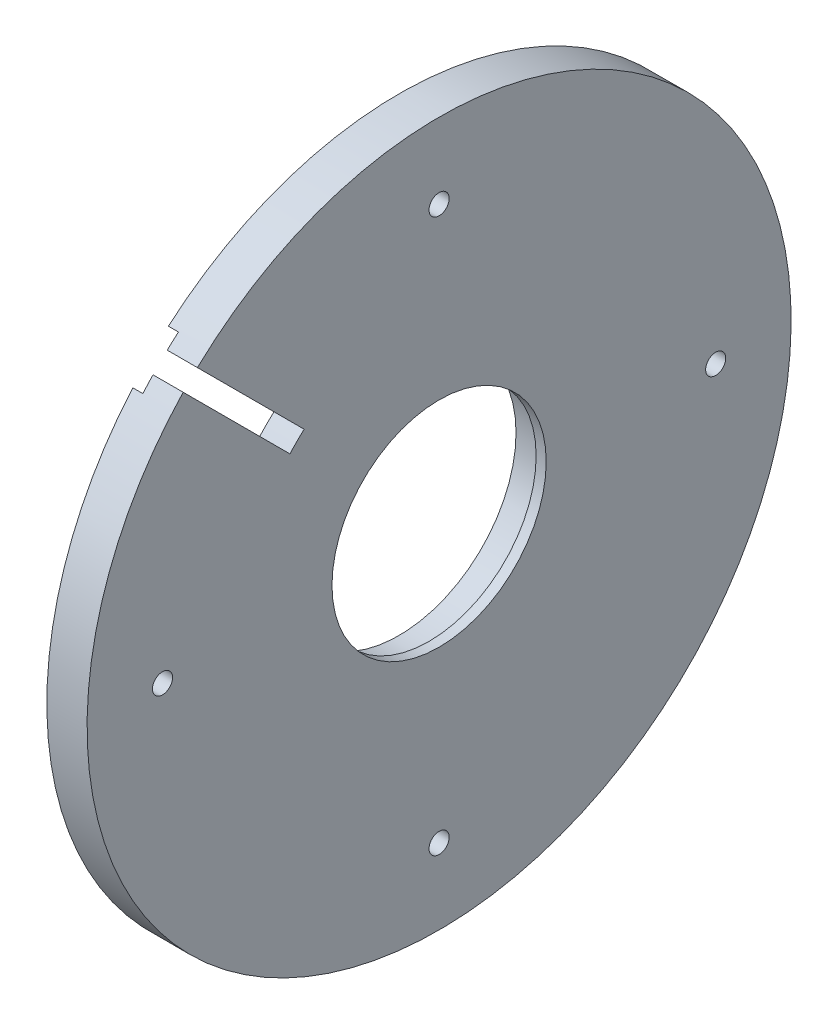
ISO-10303-21;
HEADER;
FILE_DESCRIPTION(('STEP AP214'),'2;1');
FILE_NAME('part.step','',(''),(''),'','','');
FILE_SCHEMA(('AUTOMOTIVE_DESIGN { 1 0 10303 214 1 1 1 1 }'));
ENDSEC;
DATA;
#1=APPLICATION_CONTEXT('core data for automotive mechanical design processes');
#2=APPLICATION_PROTOCOL_DEFINITION('international standard','automotive_design',2000,#1);
#3=PRODUCT_CONTEXT('',#1,'mechanical');
#4=PRODUCT('Part','Part','',(#3));
#5=PRODUCT_RELATED_PRODUCT_CATEGORY('part','',(#4));
#6=PRODUCT_DEFINITION_FORMATION('','',#4);
#7=PRODUCT_DEFINITION_CONTEXT('part definition',#1,'design');
#8=PRODUCT_DEFINITION('design','',#6,#7);
#9=PRODUCT_DEFINITION_SHAPE('','',#8);
#10=(LENGTH_UNIT() NAMED_UNIT(*) SI_UNIT(.MILLI.,.METRE.));
#11=(NAMED_UNIT(*) PLANE_ANGLE_UNIT() SI_UNIT($,.RADIAN.));
#12=(NAMED_UNIT(*) SI_UNIT($,.STERADIAN.) SOLID_ANGLE_UNIT());
#13=UNCERTAINTY_MEASURE_WITH_UNIT(LENGTH_MEASURE(1.E-05),#10,'distance_accuracy_value','');
#14=(GEOMETRIC_REPRESENTATION_CONTEXT(3) GLOBAL_UNCERTAINTY_ASSIGNED_CONTEXT((#13)) GLOBAL_UNIT_ASSIGNED_CONTEXT((#10,
#11,#12)) REPRESENTATION_CONTEXT('',''));
#15=CARTESIAN_POINT('',(0.,0.,0.));
#16=DIRECTION('',(0.,0.,1.));
#17=DIRECTION('',(1.,0.,0.));
#18=AXIS2_PLACEMENT_3D('',#15,#16,#17);
#19=CARTESIAN_POINT('',(10.,23.4767178356885,24.9582128406425));
#20=DIRECTION('',(-1.,0.,0.));
#21=DIRECTION('',(0.,0.,1.));
#22=AXIS2_PLACEMENT_3D('',#19,#20,#21);
#23=CYLINDRICAL_SURFACE('',#22,20.);
#24=CARTESIAN_POINT('',(0.999999999999999,23.4767178356885,24.9582128406425));
#25=DIRECTION('',(-1.,0.,0.));
#26=DIRECTION('',(0.,0.,1.));
#27=AXIS2_PLACEMENT_3D('',#24,#25,#26);
#28=CIRCLE('',#27,20.);
#29=CARTESIAN_POINT('',(0.999999999999999,36.8940579463275,39.7897665136553));
#30=VERTEX_POINT('',#29);
#31=CARTESIAN_POINT('',(0.999999999999999,38.3082715087006,38.3755529512816));
#32=VERTEX_POINT('',#31);
#33=EDGE_CURVE('E179',#30,#32,#28,.T.);
#34=ORIENTED_EDGE('',*,*,#33,.F.);
#35=DIRECTION('',(-1.,0.,0.));
#36=VECTOR('',#35,1.);
#37=CARTESIAN_POINT('',(10.,36.8940579463275,39.7897665136546));
#38=LINE('',#37,#36);
#39=CARTESIAN_POINT('',(4.,36.8940579463275,39.7897665136546));
#40=VERTEX_POINT('',#39);
#41=EDGE_CURVE('E106',#40,#30,#38,.T.);
#42=ORIENTED_EDGE('',*,*,#41,.F.);
#43=CARTESIAN_POINT('',(4.,23.4767178356885,24.9582128406425));
#44=DIRECTION('',(1.,0.,0.));
#45=DIRECTION('',(0.,0.,-1.));
#46=AXIS2_PLACEMENT_3D('',#43,#44,#45);
#47=CIRCLE('',#46,20.);
#48=CARTESIAN_POINT('',(4.,38.3082715087006,38.3755529512816));
#49=VERTEX_POINT('',#48);
#50=EDGE_CURVE('E55',#40,#49,#47,.F.);
#51=ORIENTED_EDGE('',*,*,#50,.T.);
#52=DIRECTION('',(-1.,0.,0.));
#53=VECTOR('',#52,1.);
#54=CARTESIAN_POINT('',(10.,38.3082715087006,38.3755529512816));
#55=LINE('',#54,#53);
#56=EDGE_CURVE('E135',#49,#32,#55,.T.);
#57=ORIENTED_EDGE('',*,*,#56,.T.);
#58=EDGE_LOOP('',(#34,#42,#51,#57));
#59=FACE_BOUND('',#58,.T.);
#60=ADVANCED_FACE('F32',(#59),#23,.T.);
#61=CARTESIAN_POINT('',(10.,38.3082715087006,38.3755529512816));
#62=DIRECTION('',(0.,0.707106781186552,-0.707106781186543));
#63=DIRECTION('',(0.,0.707106781186543,0.707106781186552));
#64=AXIS2_PLACEMENT_3D('',#61,#62,#63);
#65=PLANE('',#64);
#66=DIRECTION('',(0.,-0.707106781186543,-0.707106781186552));
#67=VECTOR('',#66,1.);
#68=CARTESIAN_POINT('',(1.,38.9214510333326,38.9887324759136));
#69=LINE('',#68,#67);
#70=CARTESIAN_POINT('',(1.,48.9224583705808,48.9897398131619));
#71=VERTEX_POINT('',#70);
#72=EDGE_CURVE('E413',#71,#32,#69,.T.);
#73=ORIENTED_EDGE('',*,*,#72,.T.);
#74=ORIENTED_EDGE('',*,*,#56,.F.);
#75=DIRECTION('',(0.,0.707106781186543,0.707106781186552));
#76=VECTOR('',#75,1.);
#77=CARTESIAN_POINT('',(4.,24.183824616875,24.2511060594558));
#78=LINE('',#77,#76);
#79=CARTESIAN_POINT('',(4.,48.9224583705808,48.9897398131619));
#80=VERTEX_POINT('',#79);
#81=EDGE_CURVE('E206',#49,#80,#78,.T.);
#82=ORIENTED_EDGE('',*,*,#81,.T.);
#83=DIRECTION('',(-1.,0.,0.));
#84=VECTOR('',#83,1.);
#85=CARTESIAN_POINT('',(4.,48.9224583705808,48.9897398131619));
#86=LINE('',#85,#84);
#87=EDGE_CURVE('E47',#71,#80,#86,.F.);
#88=ORIENTED_EDGE('',*,*,#87,.F.);
#89=EDGE_LOOP('',(#73,#74,#82,#88));
#90=FACE_BOUND('',#89,.T.);
#91=ADVANCED_FACE('F236',(#90),#65,.F.);
#92=CARTESIAN_POINT('',(10.,47.5183483960309,50.4140569633582));
#93=DIRECTION('',(0.,-0.707106781186528,0.707106781186567));
#94=DIRECTION('',(0.,-0.707106781186567,-0.707106781186528));
#95=AXIS2_PLACEMENT_3D('',#92,#93,#94);
#96=PLANE('',#95);
#97=DIRECTION('',(0.,-0.707106781186567,-0.707106781186528));
#98=VECTOR('',#97,1.);
#99=CARTESIAN_POINT('',(0.999999999999999,47.5183483960309,50.4140569633582));
#100=LINE('',#99,#98);
#101=CARTESIAN_POINT('',(1.,47.5082448082077,50.403953375535));
#102=VERTEX_POINT('',#101);
#103=EDGE_CURVE('E100',#102,#30,#100,.T.);
#104=ORIENTED_EDGE('',*,*,#103,.F.);
#105=DIRECTION('',(-1.,0.,0.));
#106=VECTOR('',#105,1.);
#107=CARTESIAN_POINT('',(4.,47.5082448082077,50.403953375535));
#108=LINE('',#107,#106);
#109=CARTESIAN_POINT('',(4.,47.5082448082077,50.403953375535));
#110=VERTEX_POINT('',#109);
#111=EDGE_CURVE('E104',#110,#102,#108,.T.);
#112=ORIENTED_EDGE('',*,*,#111,.F.);
#113=DIRECTION('',(0.,-0.707106781186567,-0.707106781186528));
#114=VECTOR('',#113,1.);
#115=CARTESIAN_POINT('',(4.,22.7696110545011,25.6653196218298));
#116=LINE('',#115,#114);
#117=EDGE_CURVE('E203',#110,#40,#116,.T.);
#118=ORIENTED_EDGE('',*,*,#117,.T.);
#119=ORIENTED_EDGE('',*,*,#41,.T.);
#120=EDGE_LOOP('',(#104,#112,#118,#119));
#121=FACE_BOUND('',#120,.T.);
#122=ADVANCED_FACE('F102',(#121),#96,.F.);
#123=CARTESIAN_POINT('',(3.,23.4767178356883,24.9582128406425));
#124=DIRECTION('',(-1.,0.,0.));
#125=DIRECTION('',(0.,0.,1.));
#126=AXIS2_PLACEMENT_3D('',#123,#124,#125);
#127=PLANE('',#126);
#128=CARTESIAN_POINT('',(3.,23.4767178356883,24.9582128406425));
#129=DIRECTION('',(-1.,0.,0.));
#130=DIRECTION('',(0.,0.,1.));
#131=AXIS2_PLACEMENT_3D('',#128,#129,#130);
#132=CIRCLE('',#131,10.6500000000003);
#133=CARTESIAN_POINT('',(3.,23.4767178356883,35.6082128406428));
#134=VERTEX_POINT('',#133);
#135=EDGE_CURVE('E189',#134,#134,#132,.T.);
#136=ORIENTED_EDGE('',*,*,#135,.F.);
#137=EDGE_LOOP('',(#136));
#138=FACE_BOUND('',#137,.T.);
#139=CARTESIAN_POINT('',(3.,23.4767178356883,24.9582128406425));
#140=DIRECTION('',(-1.,0.,0.));
#141=DIRECTION('',(0.,0.,1.));
#142=AXIS2_PLACEMENT_3D('',#139,#140,#141);
#143=CIRCLE('',#142,11.1500000000002);
#144=CARTESIAN_POINT('',(3.,23.4767178356883,36.1082128406427));
#145=VERTEX_POINT('',#144);
#146=EDGE_CURVE('E119',#145,#145,#143,.T.);
#147=ORIENTED_EDGE('',*,*,#146,.T.);
#148=EDGE_LOOP('',(#147));
#149=FACE_BOUND('',#148,.T.);
#150=ADVANCED_FACE('F247',(#138,#149),#127,.T.);
#151=CARTESIAN_POINT('',(4.,23.4767178356883,24.9582128406425));
#152=DIRECTION('',(1.,0.,0.));
#153=DIRECTION('',(0.,0.,-1.));
#154=AXIS2_PLACEMENT_3D('',#151,#152,#153);
#155=PLANE('',#154);
#156=CARTESIAN_POINT('',(4.,50.9767178356883,24.9582128406422));
#157=DIRECTION('',(1.,0.,0.));
#158=DIRECTION('',(0.,0.,-1.));
#159=AXIS2_PLACEMENT_3D('',#156,#157,#158);
#160=CIRCLE('',#159,1.);
#161=CARTESIAN_POINT('',(4.,50.9767178356883,23.9582128406422));
#162=VERTEX_POINT('',#161);
#163=EDGE_CURVE('E148',#162,#162,#160,.T.);
#164=ORIENTED_EDGE('',*,*,#163,.F.);
#165=EDGE_LOOP('',(#164));
#166=FACE_BOUND('',#165,.T.);
#167=CARTESIAN_POINT('',(4.,23.4767178356885,52.4582128406425));
#168=DIRECTION('',(1.,0.,0.));
#169=DIRECTION('',(0.,0.,-1.));
#170=AXIS2_PLACEMENT_3D('',#167,#168,#169);
#171=CIRCLE('',#170,0.999999999999996);
#172=CARTESIAN_POINT('',(4.,23.4767178356885,51.4582128406425));
#173=VERTEX_POINT('',#172);
#174=EDGE_CURVE('E144',#173,#173,#171,.T.);
#175=ORIENTED_EDGE('',*,*,#174,.F.);
#176=EDGE_LOOP('',(#175));
#177=FACE_BOUND('',#176,.T.);
#178=CARTESIAN_POINT('',(4.,-4.02328216431167,24.9582128406426));
#179=DIRECTION('',(1.,0.,0.));
#180=DIRECTION('',(0.,0.,-1.));
#181=AXIS2_PLACEMENT_3D('',#178,#179,#180);
#182=CIRCLE('',#181,1.);
#183=CARTESIAN_POINT('',(4.,-4.02328216431167,23.9582128406426));
#184=VERTEX_POINT('',#183);
#185=EDGE_CURVE('E140',#184,#184,#182,.T.);
#186=ORIENTED_EDGE('',*,*,#185,.F.);
#187=EDGE_LOOP('',(#186));
#188=FACE_BOUND('',#187,.T.);
#189=CARTESIAN_POINT('',(4.,23.4767178356883,-2.54178715935752));
#190=DIRECTION('',(1.,0.,0.));
#191=DIRECTION('',(0.,0.,-1.));
#192=AXIS2_PLACEMENT_3D('',#189,#190,#191);
#193=CIRCLE('',#192,1.);
#194=CARTESIAN_POINT('',(4.,23.4767178356883,-3.54178715935752));
#195=VERTEX_POINT('',#194);
#196=EDGE_CURVE('E136',#195,#195,#193,.T.);
#197=ORIENTED_EDGE('',*,*,#196,.F.);
#198=EDGE_LOOP('',(#197));
#199=FACE_BOUND('',#198,.T.);
#200=ORIENTED_EDGE('',*,*,#81,.F.);
#201=ORIENTED_EDGE('',*,*,#50,.F.);
#202=ORIENTED_EDGE('',*,*,#117,.F.);
#203=CARTESIAN_POINT('',(4.,23.4767178356883,24.9582128406425));
#204=DIRECTION('',(1.,0.,0.));
#205=DIRECTION('',(0.,0.,-1.));
#206=AXIS2_PLACEMENT_3D('',#203,#204,#205);
#207=CIRCLE('',#206,35.);
#208=EDGE_CURVE('E124',#110,#80,#207,.T.);
#209=ORIENTED_EDGE('',*,*,#208,.T.);
#210=EDGE_LOOP('',(#200,#201,#202,#209));
#211=FACE_BOUND('',#210,.T.);
#212=CARTESIAN_POINT('',(4.,23.4767178356883,24.9582128406425));
#213=DIRECTION('',(-1.,0.,0.));
#214=DIRECTION('',(0.,0.,1.));
#215=AXIS2_PLACEMENT_3D('',#212,#213,#214);
#216=CIRCLE('',#215,10.6500000000003);
#217=CARTESIAN_POINT('',(4.,23.4767178356883,35.6082128406428));
#218=VERTEX_POINT('',#217);
#219=EDGE_CURVE('E188',#218,#218,#216,.T.);
#220=ORIENTED_EDGE('',*,*,#219,.T.);
#221=EDGE_LOOP('',(#220));
#222=FACE_BOUND('',#221,.T.);
#223=ADVANCED_FACE('F249',(#166,#177,#188,#199,#211,#222),#155,.T.);
#224=CARTESIAN_POINT('',(0.,23.4767178356883,24.9582128406425));
#225=DIRECTION('',(1.,0.,0.));
#226=DIRECTION('',(0.,0.,-1.));
#227=AXIS2_PLACEMENT_3D('',#224,#225,#226);
#228=PLANE('',#227);
#229=CARTESIAN_POINT('',(0.,50.9767178356883,24.9582128406422));
#230=DIRECTION('',(1.,0.,0.));
#231=DIRECTION('',(0.,0.,-1.));
#232=AXIS2_PLACEMENT_3D('',#229,#230,#231);
#233=CIRCLE('',#232,1.);
#234=CARTESIAN_POINT('',(0.,50.9767178356883,23.9582128406422));
#235=VERTEX_POINT('',#234);
#236=EDGE_CURVE('E145',#235,#235,#233,.T.);
#237=ORIENTED_EDGE('',*,*,#236,.T.);
#238=EDGE_LOOP('',(#237));
#239=FACE_BOUND('',#238,.T.);
#240=CARTESIAN_POINT('',(0.,23.4767178356885,52.4582128406425));
#241=DIRECTION('',(1.,0.,0.));
#242=DIRECTION('',(0.,0.,-1.));
#243=AXIS2_PLACEMENT_3D('',#240,#241,#242);
#244=CIRCLE('',#243,0.999999999999996);
#245=CARTESIAN_POINT('',(0.,23.4767178356885,51.4582128406425));
#246=VERTEX_POINT('',#245);
#247=EDGE_CURVE('E141',#246,#246,#244,.T.);
#248=ORIENTED_EDGE('',*,*,#247,.T.);
#249=EDGE_LOOP('',(#248));
#250=FACE_BOUND('',#249,.T.);
#251=CARTESIAN_POINT('',(0.,-4.02328216431167,24.9582128406426));
#252=DIRECTION('',(1.,0.,0.));
#253=DIRECTION('',(0.,0.,-1.));
#254=AXIS2_PLACEMENT_3D('',#251,#252,#253);
#255=CIRCLE('',#254,1.);
#256=CARTESIAN_POINT('',(0.,-4.02328216431167,23.9582128406426));
#257=VERTEX_POINT('',#256);
#258=EDGE_CURVE('E137',#257,#257,#255,.T.);
#259=ORIENTED_EDGE('',*,*,#258,.T.);
#260=EDGE_LOOP('',(#259));
#261=FACE_BOUND('',#260,.T.);
#262=CARTESIAN_POINT('',(0.,23.4767178356883,-2.54178715935752));
#263=DIRECTION('',(1.,0.,0.));
#264=DIRECTION('',(0.,0.,-1.));
#265=AXIS2_PLACEMENT_3D('',#262,#263,#264);
#266=CIRCLE('',#265,1.);
#267=CARTESIAN_POINT('',(0.,23.4767178356883,-3.54178715935752));
#268=VERTEX_POINT('',#267);
#269=EDGE_CURVE('E132',#268,#268,#266,.T.);
#270=ORIENTED_EDGE('',*,*,#269,.T.);
#271=EDGE_LOOP('',(#270));
#272=FACE_BOUND('',#271,.T.);
#273=DIRECTION('',(0.,-0.707106781186547,0.707106781186547));
#274=VECTOR('',#273,1.);
#275=CARTESIAN_POINT('',(0.,37.6011647275139,35.5471258265354));
#276=LINE('',#275,#274);
#277=CARTESIAN_POINT('',(0.,37.6011647275139,35.5471258265354));
#278=VERTEX_POINT('',#277);
#279=CARTESIAN_POINT('',(0.,34.0656308215811,39.0826597324682));
#280=VERTEX_POINT('',#279);
#281=EDGE_CURVE('E169',#278,#280,#276,.T.);
#282=ORIENTED_EDGE('',*,*,#281,.F.);
#283=DIRECTION('',(0.,-0.707106781186548,-0.707106781186548));
#284=VECTOR('',#283,1.);
#285=CARTESIAN_POINT('',(0.,38.3082715087005,36.254232607722));
#286=LINE('',#285,#284);
#287=CARTESIAN_POINT('',(0.,49.9300068613191,47.8759679603405));
#288=VERTEX_POINT('',#287);
#289=EDGE_CURVE('E160',#288,#278,#286,.T.);
#290=ORIENTED_EDGE('',*,*,#289,.F.);
#291=CARTESIAN_POINT('',(0.,23.4767178356883,24.9582128406425));
#292=DIRECTION('',(1.,0.,0.));
#293=DIRECTION('',(0.,0.,-1.));
#294=AXIS2_PLACEMENT_3D('',#291,#292,#293);
#295=CIRCLE('',#294,35.);
#296=CARTESIAN_POINT('',(0.,46.3944729553863,51.4115018662733));
#297=VERTEX_POINT('',#296);
#298=EDGE_CURVE('E128',#297,#288,#295,.T.);
#299=ORIENTED_EDGE('',*,*,#298,.F.);
#300=DIRECTION('',(0.,0.707106781186551,0.707106781186544));
#301=VECTOR('',#300,1.);
#302=CARTESIAN_POINT('',(0.,47.5082448082077,52.5252737190947));
#303=LINE('',#302,#301);
#304=EDGE_CURVE('E170',#280,#297,#303,.T.);
#305=ORIENTED_EDGE('',*,*,#304,.F.);
#306=EDGE_LOOP('',(#282,#290,#299,#305));
#307=FACE_BOUND('',#306,.T.);
#308=CARTESIAN_POINT('',(0.,23.4767178356883,24.9582128406425));
#309=DIRECTION('',(1.,0.,0.));
#310=DIRECTION('',(0.,0.,-1.));
#311=AXIS2_PLACEMENT_3D('',#308,#309,#310);
#312=CIRCLE('',#311,11.6500000000002);
#313=CARTESIAN_POINT('',(0.,23.4767178356883,13.3082128406423));
#314=VERTEX_POINT('',#313);
#315=EDGE_CURVE('E209',#314,#314,#312,.T.);
#316=ORIENTED_EDGE('',*,*,#315,.T.);
#317=EDGE_LOOP('',(#316));
#318=FACE_BOUND('',#317,.T.);
#319=ADVANCED_FACE('F165',(#239,#250,#261,#272,#307,#318),#228,.F.);
#320=CARTESIAN_POINT('',(4.,23.4767178356883,24.9582128406425));
#321=DIRECTION('',(-1.,0.,0.));
#322=DIRECTION('',(0.,0.,1.));
#323=AXIS2_PLACEMENT_3D('',#320,#321,#322);
#324=CYLINDRICAL_SURFACE('',#323,35.);
#325=CARTESIAN_POINT('',(1.,23.4767178356883,24.9582128406425));
#326=DIRECTION('',(-1.,0.,0.));
#327=DIRECTION('',(0.,0.,1.));
#328=AXIS2_PLACEMENT_3D('',#325,#326,#327);
#329=CIRCLE('',#328,35.);
#330=CARTESIAN_POINT('',(1.,46.3944729553862,51.4115018662733));
#331=VERTEX_POINT('',#330);
#332=EDGE_CURVE('E114',#331,#102,#329,.T.);
#333=ORIENTED_EDGE('',*,*,#332,.F.);
#334=DIRECTION('',(-1.,0.,0.));
#335=VECTOR('',#334,1.);
#336=CARTESIAN_POINT('',(4.,46.3944729553863,51.4115018662733));
#337=LINE('',#336,#335);
#338=EDGE_CURVE('E11',#331,#297,#337,.T.);
#339=ORIENTED_EDGE('',*,*,#338,.T.);
#340=ORIENTED_EDGE('',*,*,#298,.T.);
#341=DIRECTION('',(-1.,0.,0.));
#342=VECTOR('',#341,1.);
#343=CARTESIAN_POINT('',(4.,49.9300068613191,47.8759679603405));
#344=LINE('',#343,#342);
#345=CARTESIAN_POINT('',(1.,49.930006861319,47.8759679603405));
#346=VERTEX_POINT('',#345);
#347=EDGE_CURVE('E40',#288,#346,#344,.F.);
#348=ORIENTED_EDGE('',*,*,#347,.T.);
#349=EDGE_CURVE('E120',#71,#346,#329,.T.);
#350=ORIENTED_EDGE('',*,*,#349,.F.);
#351=ORIENTED_EDGE('',*,*,#87,.T.);
#352=ORIENTED_EDGE('',*,*,#208,.F.);
#353=ORIENTED_EDGE('',*,*,#111,.T.);
#354=EDGE_LOOP('',(#333,#339,#340,#348,#350,#351,#352,#353));
#355=FACE_BOUND('',#354,.T.);
#356=ADVANCED_FACE('F122',(#355),#324,.T.);
#357=CARTESIAN_POINT('',(4.,23.4767178356883,24.9582128406425));
#358=DIRECTION('',(-1.,0.,0.));
#359=DIRECTION('',(0.,0.,1.));
#360=AXIS2_PLACEMENT_3D('',#357,#358,#359);
#361=CYLINDRICAL_SURFACE('',#360,11.6500000000002);
#362=ORIENTED_EDGE('',*,*,#315,.F.);
#363=EDGE_LOOP('',(#362));
#364=FACE_BOUND('',#363,.T.);
#365=CARTESIAN_POINT('',(3.25,23.4767178356883,24.9582128406425));
#366=DIRECTION('',(-1.,0.,0.));
#367=DIRECTION('',(0.,0.,1.));
#368=AXIS2_PLACEMENT_3D('',#365,#366,#367);
#369=CIRCLE('',#368,11.6500000000002);
#370=CARTESIAN_POINT('',(3.25,23.4767178356883,36.6082128406427));
#371=VERTEX_POINT('',#370);
#372=EDGE_CURVE('E185',#371,#371,#369,.T.);
#373=ORIENTED_EDGE('',*,*,#372,.F.);
#374=EDGE_LOOP('',(#373));
#375=FACE_BOUND('',#374,.T.);
#376=ADVANCED_FACE('F213',(#364,#375),#361,.F.);
#377=CARTESIAN_POINT('',(-6.,23.4767178356883,-2.54178715935752));
#378=DIRECTION('',(1.,0.,0.));
#379=DIRECTION('',(0.,0.,-1.));
#380=AXIS2_PLACEMENT_3D('',#377,#378,#379);
#381=CYLINDRICAL_SURFACE('',#380,1.);
#382=ORIENTED_EDGE('',*,*,#196,.T.);
#383=EDGE_LOOP('',(#382));
#384=FACE_BOUND('',#383,.T.);
#385=ORIENTED_EDGE('',*,*,#269,.F.);
#386=EDGE_LOOP('',(#385));
#387=FACE_BOUND('',#386,.T.);
#388=ADVANCED_FACE('F216',(#384,#387),#381,.F.);
#389=CARTESIAN_POINT('',(-6.,-4.02328216431167,24.9582128406426));
#390=DIRECTION('',(1.,0.,0.));
#391=DIRECTION('',(0.,0.,-1.));
#392=AXIS2_PLACEMENT_3D('',#389,#390,#391);
#393=CYLINDRICAL_SURFACE('',#392,1.);
#394=ORIENTED_EDGE('',*,*,#185,.T.);
#395=EDGE_LOOP('',(#394));
#396=FACE_BOUND('',#395,.T.);
#397=ORIENTED_EDGE('',*,*,#258,.F.);
#398=EDGE_LOOP('',(#397));
#399=FACE_BOUND('',#398,.T.);
#400=ADVANCED_FACE('F272',(#396,#399),#393,.F.);
#401=CARTESIAN_POINT('',(-6.,23.4767178356885,52.4582128406425));
#402=DIRECTION('',(1.,0.,0.));
#403=DIRECTION('',(0.,0.,-1.));
#404=AXIS2_PLACEMENT_3D('',#401,#402,#403);
#405=CYLINDRICAL_SURFACE('',#404,0.999999999999996);
#406=ORIENTED_EDGE('',*,*,#174,.T.);
#407=EDGE_LOOP('',(#406));
#408=FACE_BOUND('',#407,.T.);
#409=ORIENTED_EDGE('',*,*,#247,.F.);
#410=EDGE_LOOP('',(#409));
#411=FACE_BOUND('',#410,.T.);
#412=ADVANCED_FACE('F279',(#408,#411),#405,.F.);
#413=CARTESIAN_POINT('',(-6.,50.9767178356883,24.9582128406422));
#414=DIRECTION('',(1.,0.,0.));
#415=DIRECTION('',(0.,0.,-1.));
#416=AXIS2_PLACEMENT_3D('',#413,#414,#415);
#417=CYLINDRICAL_SURFACE('',#416,1.);
#418=ORIENTED_EDGE('',*,*,#163,.T.);
#419=EDGE_LOOP('',(#418));
#420=FACE_BOUND('',#419,.T.);
#421=ORIENTED_EDGE('',*,*,#236,.F.);
#422=EDGE_LOOP('',(#421));
#423=FACE_BOUND('',#422,.T.);
#424=ADVANCED_FACE('F232',(#420,#423),#417,.F.);
#425=CARTESIAN_POINT('',(3.,23.4767178356883,24.9582128406425));
#426=DIRECTION('',(1.,0.,0.));
#427=DIRECTION('',(0.,0.,-1.));
#428=AXIS2_PLACEMENT_3D('',#425,#426,#427);
#429=CYLINDRICAL_SURFACE('',#428,10.6500000000003);
#430=ORIENTED_EDGE('',*,*,#135,.T.);
#431=EDGE_LOOP('',(#430));
#432=FACE_BOUND('',#431,.T.);
#433=ORIENTED_EDGE('',*,*,#219,.F.);
#434=EDGE_LOOP('',(#433));
#435=FACE_BOUND('',#434,.T.);
#436=ADVANCED_FACE('F223',(#432,#435),#429,.F.);
#437=CARTESIAN_POINT('',(3.25,23.4767178356883,24.9582128406425));
#438=DIRECTION('',(-1.,0.,0.));
#439=DIRECTION('',(0.,0.,1.));
#440=AXIS2_PLACEMENT_3D('',#437,#438,#439);
#441=PLANE('',#440);
#442=CARTESIAN_POINT('',(3.25,23.4767178356883,24.9582128406425));
#443=DIRECTION('',(-1.,0.,0.));
#444=DIRECTION('',(0.,0.,1.));
#445=AXIS2_PLACEMENT_3D('',#442,#443,#444);
#446=CIRCLE('',#445,11.2500000000002);
#447=CARTESIAN_POINT('',(3.25,23.4767178356883,36.2082128406427));
#448=VERTEX_POINT('',#447);
#449=EDGE_CURVE('E110',#448,#448,#446,.F.);
#450=ORIENTED_EDGE('',*,*,#449,.T.);
#451=EDGE_LOOP('',(#450));
#452=FACE_BOUND('',#451,.T.);
#453=ORIENTED_EDGE('',*,*,#372,.T.);
#454=EDGE_LOOP('',(#453));
#455=FACE_BOUND('',#454,.T.);
#456=ADVANCED_FACE('F220',(#452,#455),#441,.T.);
#457=CARTESIAN_POINT('',(3.25,23.4767178356883,24.9582128406425));
#458=DIRECTION('',(-1.,0.,0.));
#459=DIRECTION('',(0.,0.,1.));
#460=AXIS2_PLACEMENT_3D('',#457,#458,#459);
#461=CYLINDRICAL_SURFACE('',#460,11.1500000000002);
#462=CARTESIAN_POINT('',(3.15,23.4767178356883,24.9582128406425));
#463=DIRECTION('',(-1.,0.,0.));
#464=DIRECTION('',(0.,0.,1.));
#465=AXIS2_PLACEMENT_3D('',#462,#463,#464);
#466=CIRCLE('',#465,11.1500000000002);
#467=CARTESIAN_POINT('',(3.15,23.4767178356883,36.1082128406427));
#468=VERTEX_POINT('',#467);
#469=EDGE_CURVE('E126',#468,#468,#466,.T.);
#470=ORIENTED_EDGE('',*,*,#469,.T.);
#471=EDGE_LOOP('',(#470));
#472=FACE_BOUND('',#471,.T.);
#473=ORIENTED_EDGE('',*,*,#146,.F.);
#474=EDGE_LOOP('',(#473));
#475=FACE_BOUND('',#474,.T.);
#476=ADVANCED_FACE('F222',(#472,#475),#461,.T.);
#477=CARTESIAN_POINT('',(3.15,23.4767178356883,24.9582128406425));
#478=DIRECTION('',(-1.,0.,0.));
#479=DIRECTION('',(0.,0.,1.));
#480=AXIS2_PLACEMENT_3D('',#477,#478,#479);
#481=TOROIDAL_SURFACE('',#480,11.2500000000002,0.1);
#482=ORIENTED_EDGE('',*,*,#449,.F.);
#483=EDGE_LOOP('',(#482));
#484=FACE_BOUND('',#483,.T.);
#485=ORIENTED_EDGE('',*,*,#469,.F.);
#486=EDGE_LOOP('',(#485));
#487=FACE_BOUND('',#486,.T.);
#488=ADVANCED_FACE('F34',(#484,#487),#481,.F.);
#489=CARTESIAN_POINT('',(1.,38.3082715087005,36.254232607722));
#490=DIRECTION('',(0.,0.707106781186548,-0.707106781186548));
#491=DIRECTION('',(0.,0.707106781186548,0.707106781186548));
#492=AXIS2_PLACEMENT_3D('',#489,#490,#491);
#493=PLANE('',#492);
#494=ORIENTED_EDGE('',*,*,#289,.T.);
#495=DIRECTION('',(-1.,0.,0.));
#496=VECTOR('',#495,1.);
#497=CARTESIAN_POINT('',(1.,37.6011647275139,35.5471258265354));
#498=LINE('',#497,#496);
#499=CARTESIAN_POINT('',(1.,37.6011647275139,35.5471258265354));
#500=VERTEX_POINT('',#499);
#501=EDGE_CURVE('E180',#500,#278,#498,.T.);
#502=ORIENTED_EDGE('',*,*,#501,.F.);
#503=DIRECTION('',(0.,-0.707106781186547,-0.707106781186547));
#504=VECTOR('',#503,1.);
#505=CARTESIAN_POINT('',(1.,38.3082715087005,36.254232607722));
#506=LINE('',#505,#504);
#507=EDGE_CURVE('E162',#346,#500,#506,.T.);
#508=ORIENTED_EDGE('',*,*,#507,.F.);
#509=ORIENTED_EDGE('',*,*,#347,.F.);
#510=EDGE_LOOP('',(#494,#502,#508,#509));
#511=FACE_BOUND('',#510,.T.);
#512=ADVANCED_FACE('F158',(#511),#493,.F.);
#513=CARTESIAN_POINT('',(1.,47.5082448082077,52.5252737190947));
#514=DIRECTION('',(0.,-0.707106781186544,0.707106781186551));
#515=DIRECTION('',(0.,-0.707106781186551,-0.707106781186544));
#516=AXIS2_PLACEMENT_3D('',#513,#514,#515);
#517=PLANE('',#516);
#518=DIRECTION('',(0.,0.707106781186547,0.707106781186547));
#519=VECTOR('',#518,1.);
#520=CARTESIAN_POINT('',(1.,34.7727376027677,39.7897665136548));
#521=LINE('',#520,#519);
#522=CARTESIAN_POINT('',(1.,34.0656308215811,39.0826597324682));
#523=VERTEX_POINT('',#522);
#524=EDGE_CURVE('E118',#523,#331,#521,.T.);
#525=ORIENTED_EDGE('',*,*,#524,.F.);
#526=DIRECTION('',(-1.,0.,0.));
#527=VECTOR('',#526,1.);
#528=CARTESIAN_POINT('',(1.,34.0656308215811,39.0826597324682));
#529=LINE('',#528,#527);
#530=EDGE_CURVE('E177',#523,#280,#529,.T.);
#531=ORIENTED_EDGE('',*,*,#530,.T.);
#532=ORIENTED_EDGE('',*,*,#304,.T.);
#533=ORIENTED_EDGE('',*,*,#338,.F.);
#534=EDGE_LOOP('',(#525,#531,#532,#533));
#535=FACE_BOUND('',#534,.T.);
#536=ADVANCED_FACE('F375',(#535),#517,.F.);
#537=CARTESIAN_POINT('',(1.,37.6011647275139,35.5471258265354));
#538=DIRECTION('',(-1.,0.,0.));
#539=DIRECTION('',(0.,0.,1.));
#540=AXIS2_PLACEMENT_3D('',#537,#538,#539);
#541=PLANE('',#540);
#542=ORIENTED_EDGE('',*,*,#332,.T.);
#543=ORIENTED_EDGE('',*,*,#103,.T.);
#544=ORIENTED_EDGE('',*,*,#33,.T.);
#545=ORIENTED_EDGE('',*,*,#72,.F.);
#546=ORIENTED_EDGE('',*,*,#349,.T.);
#547=ORIENTED_EDGE('',*,*,#507,.T.);
#548=DIRECTION('',(0.,-0.707106781186547,0.707106781186547));
#549=VECTOR('',#548,1.);
#550=CARTESIAN_POINT('',(1.,37.6011647275139,35.5471258265354));
#551=LINE('',#550,#549);
#552=EDGE_CURVE('E172',#500,#523,#551,.T.);
#553=ORIENTED_EDGE('',*,*,#552,.T.);
#554=ORIENTED_EDGE('',*,*,#524,.T.);
#555=EDGE_LOOP('',(#542,#543,#544,#545,#546,#547,#553,#554));
#556=FACE_BOUND('',#555,.T.);
#557=ADVANCED_FACE('F115',(#556),#541,.T.);
#558=CARTESIAN_POINT('',(1.,37.6011647275139,35.5471258265354));
#559=DIRECTION('',(0.,-0.707106781186547,-0.707106781186547));
#560=DIRECTION('',(0.,0.707106781186548,-0.707106781186548));
#561=AXIS2_PLACEMENT_3D('',#558,#559,#560);
#562=PLANE('',#561);
#563=ORIENTED_EDGE('',*,*,#281,.T.);
#564=ORIENTED_EDGE('',*,*,#530,.F.);
#565=ORIENTED_EDGE('',*,*,#552,.F.);
#566=ORIENTED_EDGE('',*,*,#501,.T.);
#567=EDGE_LOOP('',(#563,#564,#565,#566));
#568=FACE_BOUND('',#567,.T.);
#569=ADVANCED_FACE('F389',(#568),#562,.F.);
#570=CLOSED_SHELL('',(#60,#91,#122,#150,#223,#319,#356,#376,#388,#400,#412,#424,#436,#456,#476,
#488,#512,#536,#557,#569));
#571=MANIFOLD_SOLID_BREP('B2',#570);
#572=ADVANCED_BREP_SHAPE_REPRESENTATION('',(#18,#571),#14);
#573=SHAPE_DEFINITION_REPRESENTATION(#9,#572);
ENDSEC;
END-ISO-10303-21;
